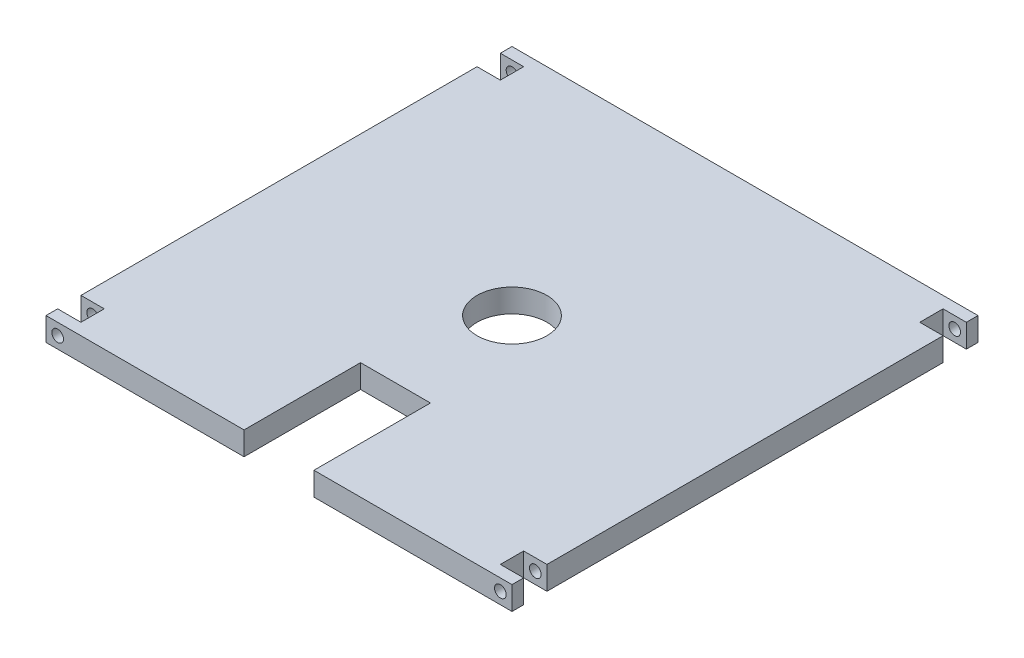
ISO-10303-21;
HEADER;
FILE_DESCRIPTION(('STEP AP214'),'2;1');
FILE_NAME('part.step','',(''),(''),'','','');
FILE_SCHEMA(('AUTOMOTIVE_DESIGN { 1 0 10303 214 1 1 1 1 }'));
ENDSEC;
DATA;
#1=APPLICATION_CONTEXT('core data for automotive mechanical design processes');
#2=APPLICATION_PROTOCOL_DEFINITION('international standard','automotive_design',2000,#1);
#3=PRODUCT_CONTEXT('',#1,'mechanical');
#4=PRODUCT('Part','Part','',(#3));
#5=PRODUCT_RELATED_PRODUCT_CATEGORY('part','',(#4));
#6=PRODUCT_DEFINITION_FORMATION('','',#4);
#7=PRODUCT_DEFINITION_CONTEXT('part definition',#1,'design');
#8=PRODUCT_DEFINITION('design','',#6,#7);
#9=PRODUCT_DEFINITION_SHAPE('','',#8);
#10=(LENGTH_UNIT() NAMED_UNIT(*) SI_UNIT(.MILLI.,.METRE.));
#11=(NAMED_UNIT(*) PLANE_ANGLE_UNIT() SI_UNIT($,.RADIAN.));
#12=(NAMED_UNIT(*) SI_UNIT($,.STERADIAN.) SOLID_ANGLE_UNIT());
#13=UNCERTAINTY_MEASURE_WITH_UNIT(LENGTH_MEASURE(1.E-05),#10,'distance_accuracy_value','');
#14=(GEOMETRIC_REPRESENTATION_CONTEXT(3) GLOBAL_UNCERTAINTY_ASSIGNED_CONTEXT((#13)) GLOBAL_UNIT_ASSIGNED_CONTEXT((#10,
#11,#12)) REPRESENTATION_CONTEXT('',''));
#15=CARTESIAN_POINT('',(0.,0.,0.));
#16=DIRECTION('',(0.,0.,1.));
#17=DIRECTION('',(1.,0.,0.));
#18=AXIS2_PLACEMENT_3D('',#15,#16,#17);
#19=CARTESIAN_POINT('',(0.,10.,0.));
#20=DIRECTION('',(0.,1.,0.));
#21=DIRECTION('',(0.,0.,1.));
#22=AXIS2_PLACEMENT_3D('',#19,#20,#21);
#23=PLANE('',#22);
#24=DIRECTION('',(1.,0.,0.));
#25=VECTOR('',#24,1.);
#26=CARTESIAN_POINT('',(-15.,10.,100.));
#27=LINE('',#26,#25);
#28=CARTESIAN_POINT('',(-100.,10.,100.));
#29=VERTEX_POINT('',#28);
#30=CARTESIAN_POINT('',(-15.,10.,100.));
#31=VERTEX_POINT('',#30);
#32=EDGE_CURVE('E274',#29,#31,#27,.T.);
#33=ORIENTED_EDGE('',*,*,#32,.T.);
#34=DIRECTION('',(0.,0.,-1.));
#35=VECTOR('',#34,1.);
#36=CARTESIAN_POINT('',(-15.,10.,100.));
#37=LINE('',#36,#35);
#38=CARTESIAN_POINT('',(-15.,10.,50.));
#39=VERTEX_POINT('',#38);
#40=EDGE_CURVE('E142',#31,#39,#37,.T.);
#41=ORIENTED_EDGE('',*,*,#40,.T.);
#42=DIRECTION('',(1.,0.,0.));
#43=VECTOR('',#42,1.);
#44=CARTESIAN_POINT('',(-15.,10.,50.));
#45=LINE('',#44,#43);
#46=CARTESIAN_POINT('',(15.,10.,50.));
#47=VERTEX_POINT('',#46);
#48=EDGE_CURVE('E338',#39,#47,#45,.T.);
#49=ORIENTED_EDGE('',*,*,#48,.T.);
#50=DIRECTION('',(0.,0.,1.));
#51=VECTOR('',#50,1.);
#52=CARTESIAN_POINT('',(15.,10.,100.));
#53=LINE('',#52,#51);
#54=CARTESIAN_POINT('',(15.,10.,100.));
#55=VERTEX_POINT('',#54);
#56=EDGE_CURVE('E357',#47,#55,#53,.T.);
#57=ORIENTED_EDGE('',*,*,#56,.T.);
#58=DIRECTION('',(1.,0.,0.));
#59=VECTOR('',#58,1.);
#60=CARTESIAN_POINT('',(100.,10.,100.));
#61=LINE('',#60,#59);
#62=CARTESIAN_POINT('',(100.,10.,100.));
#63=VERTEX_POINT('',#62);
#64=EDGE_CURVE('E354',#55,#63,#61,.T.);
#65=ORIENTED_EDGE('',*,*,#64,.T.);
#66=DIRECTION('',(0.,0.,-1.));
#67=VECTOR('',#66,1.);
#68=CARTESIAN_POINT('',(100.,10.,95.));
#69=LINE('',#68,#67);
#70=CARTESIAN_POINT('',(100.,10.,95.));
#71=VERTEX_POINT('',#70);
#72=EDGE_CURVE('E356',#63,#71,#69,.T.);
#73=ORIENTED_EDGE('',*,*,#72,.T.);
#74=DIRECTION('',(-1.,0.,0.));
#75=VECTOR('',#74,1.);
#76=CARTESIAN_POINT('',(100.,10.,95.));
#77=LINE('',#76,#75);
#78=CARTESIAN_POINT('',(90.,10.,95.));
#79=VERTEX_POINT('',#78);
#80=EDGE_CURVE('E359',#71,#79,#77,.T.);
#81=ORIENTED_EDGE('',*,*,#80,.T.);
#82=DIRECTION('',(0.,0.,-1.));
#83=VECTOR('',#82,1.);
#84=CARTESIAN_POINT('',(90.,10.,95.));
#85=LINE('',#84,#83);
#86=CARTESIAN_POINT('',(90.,10.,85.));
#87=VERTEX_POINT('',#86);
#88=EDGE_CURVE('E365',#79,#87,#85,.T.);
#89=ORIENTED_EDGE('',*,*,#88,.T.);
#90=DIRECTION('',(1.,0.,0.));
#91=VECTOR('',#90,1.);
#92=CARTESIAN_POINT('',(90.,10.,85.));
#93=LINE('',#92,#91);
#94=CARTESIAN_POINT('',(100.,10.,85.));
#95=VERTEX_POINT('',#94);
#96=EDGE_CURVE('E367',#87,#95,#93,.T.);
#97=ORIENTED_EDGE('',*,*,#96,.T.);
#98=DIRECTION('',(0.,0.,-1.));
#99=VECTOR('',#98,1.);
#100=CARTESIAN_POINT('',(100.,10.,-85.));
#101=LINE('',#100,#99);
#102=CARTESIAN_POINT('',(100.,10.,-85.));
#103=VERTEX_POINT('',#102);
#104=EDGE_CURVE('E369',#95,#103,#101,.T.);
#105=ORIENTED_EDGE('',*,*,#104,.T.);
#106=DIRECTION('',(-1.,0.,0.));
#107=VECTOR('',#106,1.);
#108=CARTESIAN_POINT('',(90.,10.,-85.));
#109=LINE('',#108,#107);
#110=CARTESIAN_POINT('',(90.,10.,-85.));
#111=VERTEX_POINT('',#110);
#112=EDGE_CURVE('E371',#103,#111,#109,.T.);
#113=ORIENTED_EDGE('',*,*,#112,.T.);
#114=DIRECTION('',(0.,0.,-1.));
#115=VECTOR('',#114,1.);
#116=CARTESIAN_POINT('',(90.,10.,-95.));
#117=LINE('',#116,#115);
#118=CARTESIAN_POINT('',(90.,10.,-95.));
#119=VERTEX_POINT('',#118);
#120=EDGE_CURVE('E373',#111,#119,#117,.T.);
#121=ORIENTED_EDGE('',*,*,#120,.T.);
#122=DIRECTION('',(1.,0.,0.));
#123=VECTOR('',#122,1.);
#124=CARTESIAN_POINT('',(100.,10.,-95.));
#125=LINE('',#124,#123);
#126=CARTESIAN_POINT('',(100.,10.,-95.));
#127=VERTEX_POINT('',#126);
#128=EDGE_CURVE('E375',#119,#127,#125,.T.);
#129=ORIENTED_EDGE('',*,*,#128,.T.);
#130=DIRECTION('',(0.,0.,-1.));
#131=VECTOR('',#130,1.);
#132=CARTESIAN_POINT('',(100.,10.,-100.));
#133=LINE('',#132,#131);
#134=CARTESIAN_POINT('',(100.,10.,-100.));
#135=VERTEX_POINT('',#134);
#136=EDGE_CURVE('E377',#127,#135,#133,.T.);
#137=ORIENTED_EDGE('',*,*,#136,.T.);
#138=DIRECTION('',(-1.,0.,0.));
#139=VECTOR('',#138,1.);
#140=CARTESIAN_POINT('',(100.,10.,-100.));
#141=LINE('',#140,#139);
#142=CARTESIAN_POINT('',(-100.,10.,-100.));
#143=VERTEX_POINT('',#142);
#144=EDGE_CURVE('E379',#135,#143,#141,.T.);
#145=ORIENTED_EDGE('',*,*,#144,.T.);
#146=DIRECTION('',(0.,0.,1.));
#147=VECTOR('',#146,1.);
#148=CARTESIAN_POINT('',(-100.,10.,-100.));
#149=LINE('',#148,#147);
#150=CARTESIAN_POINT('',(-100.,10.,-95.));
#151=VERTEX_POINT('',#150);
#152=EDGE_CURVE('E381',#143,#151,#149,.T.);
#153=ORIENTED_EDGE('',*,*,#152,.T.);
#154=DIRECTION('',(1.,0.,0.));
#155=VECTOR('',#154,1.);
#156=CARTESIAN_POINT('',(-100.,10.,-95.));
#157=LINE('',#156,#155);
#158=CARTESIAN_POINT('',(-90.,10.,-95.));
#159=VERTEX_POINT('',#158);
#160=EDGE_CURVE('E383',#151,#159,#157,.T.);
#161=ORIENTED_EDGE('',*,*,#160,.T.);
#162=DIRECTION('',(0.,0.,1.));
#163=VECTOR('',#162,1.);
#164=CARTESIAN_POINT('',(-90.,10.,-95.));
#165=LINE('',#164,#163);
#166=CARTESIAN_POINT('',(-90.,10.,-85.));
#167=VERTEX_POINT('',#166);
#168=EDGE_CURVE('E385',#159,#167,#165,.T.);
#169=ORIENTED_EDGE('',*,*,#168,.T.);
#170=DIRECTION('',(-1.,0.,0.));
#171=VECTOR('',#170,1.);
#172=CARTESIAN_POINT('',(-90.,10.,-85.));
#173=LINE('',#172,#171);
#174=CARTESIAN_POINT('',(-100.,10.,-85.));
#175=VERTEX_POINT('',#174);
#176=EDGE_CURVE('E387',#167,#175,#173,.T.);
#177=ORIENTED_EDGE('',*,*,#176,.T.);
#178=DIRECTION('',(0.,0.,1.));
#179=VECTOR('',#178,1.);
#180=CARTESIAN_POINT('',(-100.,10.,-85.));
#181=LINE('',#180,#179);
#182=CARTESIAN_POINT('',(-100.,10.,85.));
#183=VERTEX_POINT('',#182);
#184=EDGE_CURVE('E389',#175,#183,#181,.T.);
#185=ORIENTED_EDGE('',*,*,#184,.T.);
#186=DIRECTION('',(1.,0.,0.));
#187=VECTOR('',#186,1.);
#188=CARTESIAN_POINT('',(-90.,10.,85.));
#189=LINE('',#188,#187);
#190=CARTESIAN_POINT('',(-90.,10.,85.));
#191=VERTEX_POINT('',#190);
#192=EDGE_CURVE('E209',#183,#191,#189,.T.);
#193=ORIENTED_EDGE('',*,*,#192,.T.);
#194=DIRECTION('',(0.,0.,1.));
#195=VECTOR('',#194,1.);
#196=CARTESIAN_POINT('',(-90.,10.,95.));
#197=LINE('',#196,#195);
#198=CARTESIAN_POINT('',(-90.,10.,95.));
#199=VERTEX_POINT('',#198);
#200=EDGE_CURVE('E203',#191,#199,#197,.T.);
#201=ORIENTED_EDGE('',*,*,#200,.T.);
#202=DIRECTION('',(-1.,0.,0.));
#203=VECTOR('',#202,1.);
#204=CARTESIAN_POINT('',(-100.,10.,95.));
#205=LINE('',#204,#203);
#206=CARTESIAN_POINT('',(-100.,10.,95.));
#207=VERTEX_POINT('',#206);
#208=EDGE_CURVE('E207',#199,#207,#205,.T.);
#209=ORIENTED_EDGE('',*,*,#208,.T.);
#210=DIRECTION('',(0.,0.,1.));
#211=VECTOR('',#210,1.);
#212=CARTESIAN_POINT('',(-100.,10.,95.));
#213=LINE('',#212,#211);
#214=EDGE_CURVE('E51',#207,#29,#213,.T.);
#215=ORIENTED_EDGE('',*,*,#214,.T.);
#216=EDGE_LOOP('',(#33,#41,#49,#57,#65,#73,#81,#89,#97,#105,#113,#121,#129,#137,#145,#153,#161,
#169,#177,#185,#193,#201,#209,#215));
#217=FACE_BOUND('',#216,.T.);
#218=CARTESIAN_POINT('',(0.,10.,0.));
#219=DIRECTION('',(0.,1.,0.));
#220=DIRECTION('',(0.,0.,1.));
#221=AXIS2_PLACEMENT_3D('',#218,#219,#220);
#222=CIRCLE('',#221,15.);
#223=CARTESIAN_POINT('',(0.,10.,15.));
#224=VERTEX_POINT('',#223);
#225=EDGE_CURVE('E231',#224,#224,#222,.T.);
#226=ORIENTED_EDGE('',*,*,#225,.F.);
#227=EDGE_LOOP('',(#226));
#228=FACE_BOUND('',#227,.T.);
#229=ADVANCED_FACE('F33',(#217,#228),#23,.T.);
#230=CARTESIAN_POINT('',(0.,0.,0.));
#231=DIRECTION('',(0.,1.,0.));
#232=DIRECTION('',(0.,0.,1.));
#233=AXIS2_PLACEMENT_3D('',#230,#231,#232);
#234=PLANE('',#233);
#235=DIRECTION('',(1.,0.,0.));
#236=VECTOR('',#235,1.);
#237=CARTESIAN_POINT('',(-15.,0.,100.));
#238=LINE('',#237,#236);
#239=CARTESIAN_POINT('',(-100.,0.,100.));
#240=VERTEX_POINT('',#239);
#241=CARTESIAN_POINT('',(-15.,0.,100.));
#242=VERTEX_POINT('',#241);
#243=EDGE_CURVE('E227',#240,#242,#238,.T.);
#244=ORIENTED_EDGE('',*,*,#243,.F.);
#245=DIRECTION('',(0.,0.,1.));
#246=VECTOR('',#245,1.);
#247=CARTESIAN_POINT('',(-100.,0.,95.));
#248=LINE('',#247,#246);
#249=CARTESIAN_POINT('',(-100.,0.,95.));
#250=VERTEX_POINT('',#249);
#251=EDGE_CURVE('E134',#250,#240,#248,.T.);
#252=ORIENTED_EDGE('',*,*,#251,.F.);
#253=DIRECTION('',(-1.,0.,0.));
#254=VECTOR('',#253,1.);
#255=CARTESIAN_POINT('',(-100.,0.,95.));
#256=LINE('',#255,#254);
#257=CARTESIAN_POINT('',(-90.,0.,95.));
#258=VERTEX_POINT('',#257);
#259=EDGE_CURVE('E128',#258,#250,#256,.T.);
#260=ORIENTED_EDGE('',*,*,#259,.F.);
#261=DIRECTION('',(0.,0.,1.));
#262=VECTOR('',#261,1.);
#263=CARTESIAN_POINT('',(-90.,0.,95.));
#264=LINE('',#263,#262);
#265=CARTESIAN_POINT('',(-90.,0.,85.));
#266=VERTEX_POINT('',#265);
#267=EDGE_CURVE('E217',#266,#258,#264,.T.);
#268=ORIENTED_EDGE('',*,*,#267,.F.);
#269=DIRECTION('',(1.,0.,0.));
#270=VECTOR('',#269,1.);
#271=CARTESIAN_POINT('',(-90.,0.,85.));
#272=LINE('',#271,#270);
#273=CARTESIAN_POINT('',(-100.,0.,85.));
#274=VERTEX_POINT('',#273);
#275=EDGE_CURVE('E269',#274,#266,#272,.T.);
#276=ORIENTED_EDGE('',*,*,#275,.F.);
#277=DIRECTION('',(0.,0.,1.));
#278=VECTOR('',#277,1.);
#279=CARTESIAN_POINT('',(-100.,0.,-85.));
#280=LINE('',#279,#278);
#281=CARTESIAN_POINT('',(-100.,0.,-85.));
#282=VERTEX_POINT('',#281);
#283=EDGE_CURVE('E267',#282,#274,#280,.T.);
#284=ORIENTED_EDGE('',*,*,#283,.F.);
#285=DIRECTION('',(-1.,0.,0.));
#286=VECTOR('',#285,1.);
#287=CARTESIAN_POINT('',(-90.,0.,-85.));
#288=LINE('',#287,#286);
#289=CARTESIAN_POINT('',(-90.,0.,-85.));
#290=VERTEX_POINT('',#289);
#291=EDGE_CURVE('E265',#290,#282,#288,.T.);
#292=ORIENTED_EDGE('',*,*,#291,.F.);
#293=DIRECTION('',(0.,0.,1.));
#294=VECTOR('',#293,1.);
#295=CARTESIAN_POINT('',(-90.,0.,-95.));
#296=LINE('',#295,#294);
#297=CARTESIAN_POINT('',(-90.,0.,-95.));
#298=VERTEX_POINT('',#297);
#299=EDGE_CURVE('E263',#298,#290,#296,.T.);
#300=ORIENTED_EDGE('',*,*,#299,.F.);
#301=DIRECTION('',(1.,0.,0.));
#302=VECTOR('',#301,1.);
#303=CARTESIAN_POINT('',(-100.,0.,-95.));
#304=LINE('',#303,#302);
#305=CARTESIAN_POINT('',(-100.,0.,-95.));
#306=VERTEX_POINT('',#305);
#307=EDGE_CURVE('E261',#306,#298,#304,.T.);
#308=ORIENTED_EDGE('',*,*,#307,.F.);
#309=DIRECTION('',(0.,0.,1.));
#310=VECTOR('',#309,1.);
#311=CARTESIAN_POINT('',(-100.,0.,-100.));
#312=LINE('',#311,#310);
#313=CARTESIAN_POINT('',(-100.,0.,-100.));
#314=VERTEX_POINT('',#313);
#315=EDGE_CURVE('E259',#314,#306,#312,.T.);
#316=ORIENTED_EDGE('',*,*,#315,.F.);
#317=DIRECTION('',(-1.,0.,0.));
#318=VECTOR('',#317,1.);
#319=CARTESIAN_POINT('',(100.,0.,-100.));
#320=LINE('',#319,#318);
#321=CARTESIAN_POINT('',(100.,0.,-100.));
#322=VERTEX_POINT('',#321);
#323=EDGE_CURVE('E257',#322,#314,#320,.T.);
#324=ORIENTED_EDGE('',*,*,#323,.F.);
#325=DIRECTION('',(0.,0.,-1.));
#326=VECTOR('',#325,1.);
#327=CARTESIAN_POINT('',(100.,0.,-100.));
#328=LINE('',#327,#326);
#329=CARTESIAN_POINT('',(100.,0.,-95.));
#330=VERTEX_POINT('',#329);
#331=EDGE_CURVE('E255',#330,#322,#328,.T.);
#332=ORIENTED_EDGE('',*,*,#331,.F.);
#333=DIRECTION('',(1.,0.,0.));
#334=VECTOR('',#333,1.);
#335=CARTESIAN_POINT('',(100.,0.,-95.));
#336=LINE('',#335,#334);
#337=CARTESIAN_POINT('',(90.,0.,-95.));
#338=VERTEX_POINT('',#337);
#339=EDGE_CURVE('E253',#338,#330,#336,.T.);
#340=ORIENTED_EDGE('',*,*,#339,.F.);
#341=DIRECTION('',(0.,0.,-1.));
#342=VECTOR('',#341,1.);
#343=CARTESIAN_POINT('',(90.,0.,-95.));
#344=LINE('',#343,#342);
#345=CARTESIAN_POINT('',(90.,0.,-85.));
#346=VERTEX_POINT('',#345);
#347=EDGE_CURVE('E251',#346,#338,#344,.T.);
#348=ORIENTED_EDGE('',*,*,#347,.F.);
#349=DIRECTION('',(-1.,0.,0.));
#350=VECTOR('',#349,1.);
#351=CARTESIAN_POINT('',(90.,0.,-85.));
#352=LINE('',#351,#350);
#353=CARTESIAN_POINT('',(100.,0.,-85.));
#354=VERTEX_POINT('',#353);
#355=EDGE_CURVE('E249',#354,#346,#352,.T.);
#356=ORIENTED_EDGE('',*,*,#355,.F.);
#357=DIRECTION('',(0.,0.,-1.));
#358=VECTOR('',#357,1.);
#359=CARTESIAN_POINT('',(100.,0.,-85.));
#360=LINE('',#359,#358);
#361=CARTESIAN_POINT('',(100.,0.,85.));
#362=VERTEX_POINT('',#361);
#363=EDGE_CURVE('E247',#362,#354,#360,.T.);
#364=ORIENTED_EDGE('',*,*,#363,.F.);
#365=DIRECTION('',(1.,0.,0.));
#366=VECTOR('',#365,1.);
#367=CARTESIAN_POINT('',(90.,0.,85.));
#368=LINE('',#367,#366);
#369=CARTESIAN_POINT('',(90.,0.,85.));
#370=VERTEX_POINT('',#369);
#371=EDGE_CURVE('E245',#370,#362,#368,.T.);
#372=ORIENTED_EDGE('',*,*,#371,.F.);
#373=DIRECTION('',(0.,0.,-1.));
#374=VECTOR('',#373,1.);
#375=CARTESIAN_POINT('',(90.,0.,95.));
#376=LINE('',#375,#374);
#377=CARTESIAN_POINT('',(90.,0.,95.));
#378=VERTEX_POINT('',#377);
#379=EDGE_CURVE('E243',#378,#370,#376,.T.);
#380=ORIENTED_EDGE('',*,*,#379,.F.);
#381=DIRECTION('',(-1.,0.,0.));
#382=VECTOR('',#381,1.);
#383=CARTESIAN_POINT('',(100.,0.,95.));
#384=LINE('',#383,#382);
#385=CARTESIAN_POINT('',(100.,0.,95.));
#386=VERTEX_POINT('',#385);
#387=EDGE_CURVE('E241',#386,#378,#384,.T.);
#388=ORIENTED_EDGE('',*,*,#387,.F.);
#389=DIRECTION('',(0.,0.,-1.));
#390=VECTOR('',#389,1.);
#391=CARTESIAN_POINT('',(100.,0.,95.));
#392=LINE('',#391,#390);
#393=CARTESIAN_POINT('',(100.,0.,100.));
#394=VERTEX_POINT('',#393);
#395=EDGE_CURVE('E239',#394,#386,#392,.T.);
#396=ORIENTED_EDGE('',*,*,#395,.F.);
#397=DIRECTION('',(1.,0.,0.));
#398=VECTOR('',#397,1.);
#399=CARTESIAN_POINT('',(100.,0.,100.));
#400=LINE('',#399,#398);
#401=CARTESIAN_POINT('',(15.,0.,100.));
#402=VERTEX_POINT('',#401);
#403=EDGE_CURVE('E237',#402,#394,#400,.T.);
#404=ORIENTED_EDGE('',*,*,#403,.F.);
#405=DIRECTION('',(0.,0.,1.));
#406=VECTOR('',#405,1.);
#407=CARTESIAN_POINT('',(15.,0.,100.));
#408=LINE('',#407,#406);
#409=CARTESIAN_POINT('',(15.,0.,50.));
#410=VERTEX_POINT('',#409);
#411=EDGE_CURVE('E235',#410,#402,#408,.T.);
#412=ORIENTED_EDGE('',*,*,#411,.F.);
#413=DIRECTION('',(1.,0.,0.));
#414=VECTOR('',#413,1.);
#415=CARTESIAN_POINT('',(-15.,0.,50.));
#416=LINE('',#415,#414);
#417=CARTESIAN_POINT('',(-15.,0.,50.));
#418=VERTEX_POINT('',#417);
#419=EDGE_CURVE('E233',#418,#410,#416,.T.);
#420=ORIENTED_EDGE('',*,*,#419,.F.);
#421=DIRECTION('',(0.,0.,-1.));
#422=VECTOR('',#421,1.);
#423=CARTESIAN_POINT('',(-15.,0.,100.));
#424=LINE('',#423,#422);
#425=EDGE_CURVE('E230',#242,#418,#424,.T.);
#426=ORIENTED_EDGE('',*,*,#425,.F.);
#427=EDGE_LOOP('',(#244,#252,#260,#268,#276,#284,#292,#300,#308,#316,#324,#332,#340,#348,#356,
#364,#372,#380,#388,#396,#404,#412,#420,#426));
#428=FACE_BOUND('',#427,.T.);
#429=CARTESIAN_POINT('',(0.,0.,0.));
#430=DIRECTION('',(0.,1.,0.));
#431=DIRECTION('',(0.,0.,1.));
#432=AXIS2_PLACEMENT_3D('',#429,#430,#431);
#433=CIRCLE('',#432,15.);
#434=CARTESIAN_POINT('',(0.,0.,15.));
#435=VERTEX_POINT('',#434);
#436=EDGE_CURVE('E480',#435,#435,#433,.T.);
#437=ORIENTED_EDGE('',*,*,#436,.T.);
#438=EDGE_LOOP('',(#437));
#439=FACE_BOUND('',#438,.T.);
#440=ADVANCED_FACE('F342',(#428,#439),#234,.F.);
#441=CARTESIAN_POINT('',(-15.,10.,100.));
#442=DIRECTION('',(0.,0.,-1.));
#443=DIRECTION('',(-1.,0.,0.));
#444=AXIS2_PLACEMENT_3D('',#441,#442,#443);
#445=PLANE('',#444);
#446=CARTESIAN_POINT('',(-95.,5.,100.));
#447=DIRECTION('',(0.,0.,1.));
#448=DIRECTION('',(1.,0.,0.));
#449=AXIS2_PLACEMENT_3D('',#446,#447,#448);
#450=CIRCLE('',#449,2.5);
#451=CARTESIAN_POINT('',(-92.5,5.,100.));
#452=VERTEX_POINT('',#451);
#453=EDGE_CURVE('E465',#452,#452,#450,.T.);
#454=ORIENTED_EDGE('',*,*,#453,.F.);
#455=EDGE_LOOP('',(#454));
#456=FACE_BOUND('',#455,.T.);
#457=ORIENTED_EDGE('',*,*,#243,.T.);
#458=DIRECTION('',(0.,-1.,0.));
#459=VECTOR('',#458,1.);
#460=CARTESIAN_POINT('',(-15.,10.,100.));
#461=LINE('',#460,#459);
#462=EDGE_CURVE('E11',#31,#242,#461,.T.);
#463=ORIENTED_EDGE('',*,*,#462,.F.);
#464=ORIENTED_EDGE('',*,*,#32,.F.);
#465=DIRECTION('',(0.,-1.,0.));
#466=VECTOR('',#465,1.);
#467=CARTESIAN_POINT('',(-100.,10.,100.));
#468=LINE('',#467,#466);
#469=EDGE_CURVE('E223',#29,#240,#468,.T.);
#470=ORIENTED_EDGE('',*,*,#469,.T.);
#471=EDGE_LOOP('',(#457,#463,#464,#470));
#472=FACE_BOUND('',#471,.T.);
#473=ADVANCED_FACE('F35',(#456,#472),#445,.F.);
#474=CARTESIAN_POINT('',(-15.,10.,100.));
#475=DIRECTION('',(-1.,0.,0.));
#476=DIRECTION('',(0.,0.,1.));
#477=AXIS2_PLACEMENT_3D('',#474,#475,#476);
#478=PLANE('',#477);
#479=ORIENTED_EDGE('',*,*,#425,.T.);
#480=DIRECTION('',(0.,-1.,0.));
#481=VECTOR('',#480,1.);
#482=CARTESIAN_POINT('',(-15.,10.,50.));
#483=LINE('',#482,#481);
#484=EDGE_CURVE('E43',#39,#418,#483,.T.);
#485=ORIENTED_EDGE('',*,*,#484,.F.);
#486=ORIENTED_EDGE('',*,*,#40,.F.);
#487=ORIENTED_EDGE('',*,*,#462,.T.);
#488=EDGE_LOOP('',(#479,#485,#486,#487));
#489=FACE_BOUND('',#488,.T.);
#490=ADVANCED_FACE('F569',(#489),#478,.F.);
#491=CARTESIAN_POINT('',(-15.,10.,50.));
#492=DIRECTION('',(0.,0.,-1.));
#493=DIRECTION('',(-1.,0.,0.));
#494=AXIS2_PLACEMENT_3D('',#491,#492,#493);
#495=PLANE('',#494);
#496=ORIENTED_EDGE('',*,*,#419,.T.);
#497=DIRECTION('',(0.,-1.,0.));
#498=VECTOR('',#497,1.);
#499=CARTESIAN_POINT('',(15.,10.,50.));
#500=LINE('',#499,#498);
#501=EDGE_CURVE('E329',#47,#410,#500,.T.);
#502=ORIENTED_EDGE('',*,*,#501,.F.);
#503=ORIENTED_EDGE('',*,*,#48,.F.);
#504=ORIENTED_EDGE('',*,*,#484,.T.);
#505=EDGE_LOOP('',(#496,#502,#503,#504));
#506=FACE_BOUND('',#505,.T.);
#507=ADVANCED_FACE('F336',(#506),#495,.F.);
#508=CARTESIAN_POINT('',(15.,10.,100.));
#509=DIRECTION('',(1.,0.,0.));
#510=DIRECTION('',(0.,0.,-1.));
#511=AXIS2_PLACEMENT_3D('',#508,#509,#510);
#512=PLANE('',#511);
#513=ORIENTED_EDGE('',*,*,#411,.T.);
#514=DIRECTION('',(0.,-1.,0.));
#515=VECTOR('',#514,1.);
#516=CARTESIAN_POINT('',(15.,10.,100.));
#517=LINE('',#516,#515);
#518=EDGE_CURVE('E326',#55,#402,#517,.T.);
#519=ORIENTED_EDGE('',*,*,#518,.F.);
#520=ORIENTED_EDGE('',*,*,#56,.F.);
#521=ORIENTED_EDGE('',*,*,#501,.T.);
#522=EDGE_LOOP('',(#513,#519,#520,#521));
#523=FACE_BOUND('',#522,.T.);
#524=ADVANCED_FACE('F348',(#523),#512,.F.);
#525=CARTESIAN_POINT('',(100.,10.,100.));
#526=DIRECTION('',(0.,0.,-1.));
#527=DIRECTION('',(-1.,0.,0.));
#528=AXIS2_PLACEMENT_3D('',#525,#526,#527);
#529=PLANE('',#528);
#530=CARTESIAN_POINT('',(95.,5.,100.));
#531=DIRECTION('',(0.,0.,1.));
#532=DIRECTION('',(-1.,0.,0.));
#533=AXIS2_PLACEMENT_3D('',#530,#531,#532);
#534=CIRCLE('',#533,2.5);
#535=CARTESIAN_POINT('',(92.5,5.,100.));
#536=VERTEX_POINT('',#535);
#537=EDGE_CURVE('E456',#536,#536,#534,.T.);
#538=ORIENTED_EDGE('',*,*,#537,.F.);
#539=EDGE_LOOP('',(#538));
#540=FACE_BOUND('',#539,.T.);
#541=ORIENTED_EDGE('',*,*,#403,.T.);
#542=DIRECTION('',(0.,-1.,0.));
#543=VECTOR('',#542,1.);
#544=CARTESIAN_POINT('',(100.,10.,100.));
#545=LINE('',#544,#543);
#546=EDGE_CURVE('E323',#63,#394,#545,.T.);
#547=ORIENTED_EDGE('',*,*,#546,.F.);
#548=ORIENTED_EDGE('',*,*,#64,.F.);
#549=ORIENTED_EDGE('',*,*,#518,.T.);
#550=EDGE_LOOP('',(#541,#547,#548,#549));
#551=FACE_BOUND('',#550,.T.);
#552=ADVANCED_FACE('F352',(#540,#551),#529,.F.);
#553=CARTESIAN_POINT('',(100.,10.,95.));
#554=DIRECTION('',(-1.,0.,0.));
#555=DIRECTION('',(0.,0.,1.));
#556=AXIS2_PLACEMENT_3D('',#553,#554,#555);
#557=PLANE('',#556);
#558=ORIENTED_EDGE('',*,*,#395,.T.);
#559=DIRECTION('',(0.,-1.,0.));
#560=VECTOR('',#559,1.);
#561=CARTESIAN_POINT('',(100.,10.,95.));
#562=LINE('',#561,#560);
#563=EDGE_CURVE('E320',#71,#386,#562,.T.);
#564=ORIENTED_EDGE('',*,*,#563,.F.);
#565=ORIENTED_EDGE('',*,*,#72,.F.);
#566=ORIENTED_EDGE('',*,*,#546,.T.);
#567=EDGE_LOOP('',(#558,#564,#565,#566));
#568=FACE_BOUND('',#567,.T.);
#569=ADVANCED_FACE('F558',(#568),#557,.F.);
#570=CARTESIAN_POINT('',(100.,10.,95.));
#571=DIRECTION('',(0.,0.,1.));
#572=DIRECTION('',(1.,0.,0.));
#573=AXIS2_PLACEMENT_3D('',#570,#571,#572);
#574=PLANE('',#573);
#575=CARTESIAN_POINT('',(95.,5.,95.));
#576=DIRECTION('',(0.,0.,1.));
#577=DIRECTION('',(1.,0.,0.));
#578=AXIS2_PLACEMENT_3D('',#575,#576,#577);
#579=CIRCLE('',#578,2.5);
#580=CARTESIAN_POINT('',(97.5,5.,95.));
#581=VERTEX_POINT('',#580);
#582=EDGE_CURVE('E462',#581,#581,#579,.T.);
#583=ORIENTED_EDGE('',*,*,#582,.T.);
#584=EDGE_LOOP('',(#583));
#585=FACE_BOUND('',#584,.T.);
#586=ORIENTED_EDGE('',*,*,#387,.T.);
#587=DIRECTION('',(0.,-1.,0.));
#588=VECTOR('',#587,1.);
#589=CARTESIAN_POINT('',(90.,10.,95.));
#590=LINE('',#589,#588);
#591=EDGE_CURVE('E317',#79,#378,#590,.T.);
#592=ORIENTED_EDGE('',*,*,#591,.F.);
#593=ORIENTED_EDGE('',*,*,#80,.F.);
#594=ORIENTED_EDGE('',*,*,#563,.T.);
#595=EDGE_LOOP('',(#586,#592,#593,#594));
#596=FACE_BOUND('',#595,.T.);
#597=ADVANCED_FACE('F554',(#585,#596),#574,.F.);
#598=CARTESIAN_POINT('',(90.,10.,95.));
#599=DIRECTION('',(-1.,0.,0.));
#600=DIRECTION('',(0.,0.,1.));
#601=AXIS2_PLACEMENT_3D('',#598,#599,#600);
#602=PLANE('',#601);
#603=ORIENTED_EDGE('',*,*,#379,.T.);
#604=DIRECTION('',(0.,-1.,0.));
#605=VECTOR('',#604,1.);
#606=CARTESIAN_POINT('',(90.,10.,85.));
#607=LINE('',#606,#605);
#608=EDGE_CURVE('E314',#87,#370,#607,.T.);
#609=ORIENTED_EDGE('',*,*,#608,.F.);
#610=ORIENTED_EDGE('',*,*,#88,.F.);
#611=ORIENTED_EDGE('',*,*,#591,.T.);
#612=EDGE_LOOP('',(#603,#609,#610,#611));
#613=FACE_BOUND('',#612,.T.);
#614=ADVANCED_FACE('F550',(#613),#602,.F.);
#615=CARTESIAN_POINT('',(90.,10.,85.));
#616=DIRECTION('',(0.,0.,-1.));
#617=DIRECTION('',(-1.,0.,0.));
#618=AXIS2_PLACEMENT_3D('',#615,#616,#617);
#619=PLANE('',#618);
#620=CARTESIAN_POINT('',(95.,5.,85.));
#621=DIRECTION('',(0.,0.,-1.));
#622=DIRECTION('',(-1.,0.,0.));
#623=AXIS2_PLACEMENT_3D('',#620,#621,#622);
#624=CIRCLE('',#623,2.5);
#625=CARTESIAN_POINT('',(92.5,5.,85.));
#626=VERTEX_POINT('',#625);
#627=EDGE_CURVE('E454',#626,#626,#624,.T.);
#628=ORIENTED_EDGE('',*,*,#627,.T.);
#629=EDGE_LOOP('',(#628));
#630=FACE_BOUND('',#629,.T.);
#631=ORIENTED_EDGE('',*,*,#371,.T.);
#632=DIRECTION('',(0.,-1.,0.));
#633=VECTOR('',#632,1.);
#634=CARTESIAN_POINT('',(100.,10.,85.));
#635=LINE('',#634,#633);
#636=EDGE_CURVE('E311',#95,#362,#635,.T.);
#637=ORIENTED_EDGE('',*,*,#636,.F.);
#638=ORIENTED_EDGE('',*,*,#96,.F.);
#639=ORIENTED_EDGE('',*,*,#608,.T.);
#640=EDGE_LOOP('',(#631,#637,#638,#639));
#641=FACE_BOUND('',#640,.T.);
#642=ADVANCED_FACE('F546',(#630,#641),#619,.F.);
#643=CARTESIAN_POINT('',(100.,10.,-85.));
#644=DIRECTION('',(-1.,0.,0.));
#645=DIRECTION('',(0.,0.,1.));
#646=AXIS2_PLACEMENT_3D('',#643,#644,#645);
#647=PLANE('',#646);
#648=ORIENTED_EDGE('',*,*,#363,.T.);
#649=DIRECTION('',(0.,-1.,0.));
#650=VECTOR('',#649,1.);
#651=CARTESIAN_POINT('',(100.,10.,-85.));
#652=LINE('',#651,#650);
#653=EDGE_CURVE('E308',#103,#354,#652,.T.);
#654=ORIENTED_EDGE('',*,*,#653,.F.);
#655=ORIENTED_EDGE('',*,*,#104,.F.);
#656=ORIENTED_EDGE('',*,*,#636,.T.);
#657=EDGE_LOOP('',(#648,#654,#655,#656));
#658=FACE_BOUND('',#657,.T.);
#659=ADVANCED_FACE('F542',(#658),#647,.F.);
#660=CARTESIAN_POINT('',(90.,10.,-85.));
#661=DIRECTION('',(0.,0.,1.));
#662=DIRECTION('',(1.,0.,0.));
#663=AXIS2_PLACEMENT_3D('',#660,#661,#662);
#664=PLANE('',#663);
#665=CARTESIAN_POINT('',(95.,5.,-85.));
#666=DIRECTION('',(0.,0.,1.));
#667=DIRECTION('',(1.,0.,0.));
#668=AXIS2_PLACEMENT_3D('',#665,#666,#667);
#669=CIRCLE('',#668,2.5);
#670=CARTESIAN_POINT('',(97.5,5.,-85.));
#671=VERTEX_POINT('',#670);
#672=EDGE_CURVE('E451',#671,#671,#669,.T.);
#673=ORIENTED_EDGE('',*,*,#672,.T.);
#674=EDGE_LOOP('',(#673));
#675=FACE_BOUND('',#674,.T.);
#676=ORIENTED_EDGE('',*,*,#355,.T.);
#677=DIRECTION('',(0.,-1.,0.));
#678=VECTOR('',#677,1.);
#679=CARTESIAN_POINT('',(90.,10.,-85.));
#680=LINE('',#679,#678);
#681=EDGE_CURVE('E305',#111,#346,#680,.T.);
#682=ORIENTED_EDGE('',*,*,#681,.F.);
#683=ORIENTED_EDGE('',*,*,#112,.F.);
#684=ORIENTED_EDGE('',*,*,#653,.T.);
#685=EDGE_LOOP('',(#676,#682,#683,#684));
#686=FACE_BOUND('',#685,.T.);
#687=ADVANCED_FACE('F538',(#675,#686),#664,.F.);
#688=CARTESIAN_POINT('',(90.,10.,-95.));
#689=DIRECTION('',(-1.,0.,0.));
#690=DIRECTION('',(0.,0.,1.));
#691=AXIS2_PLACEMENT_3D('',#688,#689,#690);
#692=PLANE('',#691);
#693=ORIENTED_EDGE('',*,*,#347,.T.);
#694=DIRECTION('',(0.,-1.,0.));
#695=VECTOR('',#694,1.);
#696=CARTESIAN_POINT('',(90.,10.,-95.));
#697=LINE('',#696,#695);
#698=EDGE_CURVE('E302',#119,#338,#697,.T.);
#699=ORIENTED_EDGE('',*,*,#698,.F.);
#700=ORIENTED_EDGE('',*,*,#120,.F.);
#701=ORIENTED_EDGE('',*,*,#681,.T.);
#702=EDGE_LOOP('',(#693,#699,#700,#701));
#703=FACE_BOUND('',#702,.T.);
#704=ADVANCED_FACE('F535',(#703),#692,.F.);
#705=CARTESIAN_POINT('',(100.,10.,-95.));
#706=DIRECTION('',(0.,0.,-1.));
#707=DIRECTION('',(-1.,0.,0.));
#708=AXIS2_PLACEMENT_3D('',#705,#706,#707);
#709=PLANE('',#708);
#710=CARTESIAN_POINT('',(95.,5.,-95.));
#711=DIRECTION('',(0.,0.,-1.));
#712=DIRECTION('',(-1.,0.,0.));
#713=AXIS2_PLACEMENT_3D('',#710,#711,#712);
#714=CIRCLE('',#713,2.5);
#715=CARTESIAN_POINT('',(92.5,5.,-95.));
#716=VERTEX_POINT('',#715);
#717=EDGE_CURVE('E449',#716,#716,#714,.T.);
#718=ORIENTED_EDGE('',*,*,#717,.T.);
#719=EDGE_LOOP('',(#718));
#720=FACE_BOUND('',#719,.T.);
#721=ORIENTED_EDGE('',*,*,#339,.T.);
#722=DIRECTION('',(0.,-1.,0.));
#723=VECTOR('',#722,1.);
#724=CARTESIAN_POINT('',(100.,10.,-95.));
#725=LINE('',#724,#723);
#726=EDGE_CURVE('E299',#127,#330,#725,.T.);
#727=ORIENTED_EDGE('',*,*,#726,.F.);
#728=ORIENTED_EDGE('',*,*,#128,.F.);
#729=ORIENTED_EDGE('',*,*,#698,.T.);
#730=EDGE_LOOP('',(#721,#727,#728,#729));
#731=FACE_BOUND('',#730,.T.);
#732=ADVANCED_FACE('F531',(#720,#731),#709,.F.);
#733=CARTESIAN_POINT('',(100.,10.,-100.));
#734=DIRECTION('',(-1.,0.,0.));
#735=DIRECTION('',(0.,0.,1.));
#736=AXIS2_PLACEMENT_3D('',#733,#734,#735);
#737=PLANE('',#736);
#738=ORIENTED_EDGE('',*,*,#331,.T.);
#739=DIRECTION('',(0.,-1.,0.));
#740=VECTOR('',#739,1.);
#741=CARTESIAN_POINT('',(100.,10.,-100.));
#742=LINE('',#741,#740);
#743=EDGE_CURVE('E296',#135,#322,#742,.T.);
#744=ORIENTED_EDGE('',*,*,#743,.F.);
#745=ORIENTED_EDGE('',*,*,#136,.F.);
#746=ORIENTED_EDGE('',*,*,#726,.T.);
#747=EDGE_LOOP('',(#738,#744,#745,#746));
#748=FACE_BOUND('',#747,.T.);
#749=ADVANCED_FACE('F527',(#748),#737,.F.);
#750=CARTESIAN_POINT('',(100.,10.,-100.));
#751=DIRECTION('',(0.,0.,1.));
#752=DIRECTION('',(1.,0.,0.));
#753=AXIS2_PLACEMENT_3D('',#750,#751,#752);
#754=PLANE('',#753);
#755=CARTESIAN_POINT('',(95.,5.,-100.));
#756=DIRECTION('',(0.,0.,1.));
#757=DIRECTION('',(-1.,0.,0.));
#758=AXIS2_PLACEMENT_3D('',#755,#756,#757);
#759=CIRCLE('',#758,2.5);
#760=CARTESIAN_POINT('',(92.5,5.,-100.));
#761=VERTEX_POINT('',#760);
#762=EDGE_CURVE('E446',#761,#761,#759,.T.);
#763=ORIENTED_EDGE('',*,*,#762,.T.);
#764=EDGE_LOOP('',(#763));
#765=FACE_BOUND('',#764,.T.);
#766=CARTESIAN_POINT('',(-95.,5.,-100.));
#767=DIRECTION('',(0.,0.,1.));
#768=DIRECTION('',(1.,0.,0.));
#769=AXIS2_PLACEMENT_3D('',#766,#767,#768);
#770=CIRCLE('',#769,2.5);
#771=CARTESIAN_POINT('',(-92.5,5.,-100.));
#772=VERTEX_POINT('',#771);
#773=EDGE_CURVE('E466',#772,#772,#770,.T.);
#774=ORIENTED_EDGE('',*,*,#773,.T.);
#775=EDGE_LOOP('',(#774));
#776=FACE_BOUND('',#775,.T.);
#777=ORIENTED_EDGE('',*,*,#323,.T.);
#778=DIRECTION('',(0.,-1.,0.));
#779=VECTOR('',#778,1.);
#780=CARTESIAN_POINT('',(-100.,10.,-100.));
#781=LINE('',#780,#779);
#782=EDGE_CURVE('E293',#143,#314,#781,.T.);
#783=ORIENTED_EDGE('',*,*,#782,.F.);
#784=ORIENTED_EDGE('',*,*,#144,.F.);
#785=ORIENTED_EDGE('',*,*,#743,.T.);
#786=EDGE_LOOP('',(#777,#783,#784,#785));
#787=FACE_BOUND('',#786,.T.);
#788=ADVANCED_FACE('F523',(#765,#776,#787),#754,.F.);
#789=CARTESIAN_POINT('',(-100.,10.,-100.));
#790=DIRECTION('',(1.,0.,0.));
#791=DIRECTION('',(0.,0.,-1.));
#792=AXIS2_PLACEMENT_3D('',#789,#790,#791);
#793=PLANE('',#792);
#794=ORIENTED_EDGE('',*,*,#315,.T.);
#795=DIRECTION('',(0.,-1.,0.));
#796=VECTOR('',#795,1.);
#797=CARTESIAN_POINT('',(-100.,10.,-95.));
#798=LINE('',#797,#796);
#799=EDGE_CURVE('E290',#151,#306,#798,.T.);
#800=ORIENTED_EDGE('',*,*,#799,.F.);
#801=ORIENTED_EDGE('',*,*,#152,.F.);
#802=ORIENTED_EDGE('',*,*,#782,.T.);
#803=EDGE_LOOP('',(#794,#800,#801,#802));
#804=FACE_BOUND('',#803,.T.);
#805=ADVANCED_FACE('F496',(#804),#793,.F.);
#806=CARTESIAN_POINT('',(-100.,10.,-95.));
#807=DIRECTION('',(0.,0.,-1.));
#808=DIRECTION('',(-1.,0.,0.));
#809=AXIS2_PLACEMENT_3D('',#806,#807,#808);
#810=PLANE('',#809);
#811=CARTESIAN_POINT('',(-95.,5.,-95.));
#812=DIRECTION('',(0.,0.,-1.));
#813=DIRECTION('',(-1.,0.,0.));
#814=AXIS2_PLACEMENT_3D('',#811,#812,#813);
#815=CIRCLE('',#814,2.5);
#816=CARTESIAN_POINT('',(-97.5,5.,-95.));
#817=VERTEX_POINT('',#816);
#818=EDGE_CURVE('E477',#817,#817,#815,.T.);
#819=ORIENTED_EDGE('',*,*,#818,.T.);
#820=EDGE_LOOP('',(#819));
#821=FACE_BOUND('',#820,.T.);
#822=ORIENTED_EDGE('',*,*,#307,.T.);
#823=DIRECTION('',(0.,-1.,0.));
#824=VECTOR('',#823,1.);
#825=CARTESIAN_POINT('',(-90.,10.,-95.));
#826=LINE('',#825,#824);
#827=EDGE_CURVE('E287',#159,#298,#826,.T.);
#828=ORIENTED_EDGE('',*,*,#827,.F.);
#829=ORIENTED_EDGE('',*,*,#160,.F.);
#830=ORIENTED_EDGE('',*,*,#799,.T.);
#831=EDGE_LOOP('',(#822,#828,#829,#830));
#832=FACE_BOUND('',#831,.T.);
#833=ADVANCED_FACE('F491',(#821,#832),#810,.F.);
#834=CARTESIAN_POINT('',(-90.,10.,-95.));
#835=DIRECTION('',(1.,0.,0.));
#836=DIRECTION('',(0.,0.,-1.));
#837=AXIS2_PLACEMENT_3D('',#834,#835,#836);
#838=PLANE('',#837);
#839=ORIENTED_EDGE('',*,*,#299,.T.);
#840=DIRECTION('',(0.,-1.,0.));
#841=VECTOR('',#840,1.);
#842=CARTESIAN_POINT('',(-90.,10.,-85.));
#843=LINE('',#842,#841);
#844=EDGE_CURVE('E284',#167,#290,#843,.T.);
#845=ORIENTED_EDGE('',*,*,#844,.F.);
#846=ORIENTED_EDGE('',*,*,#168,.F.);
#847=ORIENTED_EDGE('',*,*,#827,.T.);
#848=EDGE_LOOP('',(#839,#845,#846,#847));
#849=FACE_BOUND('',#848,.T.);
#850=ADVANCED_FACE('F495',(#849),#838,.F.);
#851=CARTESIAN_POINT('',(-90.,10.,-85.));
#852=DIRECTION('',(0.,0.,1.));
#853=DIRECTION('',(1.,0.,0.));
#854=AXIS2_PLACEMENT_3D('',#851,#852,#853);
#855=PLANE('',#854);
#856=CARTESIAN_POINT('',(-95.,5.,-85.));
#857=DIRECTION('',(0.,0.,1.));
#858=DIRECTION('',(1.,0.,0.));
#859=AXIS2_PLACEMENT_3D('',#856,#857,#858);
#860=CIRCLE('',#859,2.5);
#861=CARTESIAN_POINT('',(-92.5,5.,-85.));
#862=VERTEX_POINT('',#861);
#863=EDGE_CURVE('E474',#862,#862,#860,.T.);
#864=ORIENTED_EDGE('',*,*,#863,.T.);
#865=EDGE_LOOP('',(#864));
#866=FACE_BOUND('',#865,.T.);
#867=ORIENTED_EDGE('',*,*,#291,.T.);
#868=DIRECTION('',(0.,-1.,0.));
#869=VECTOR('',#868,1.);
#870=CARTESIAN_POINT('',(-100.,10.,-85.));
#871=LINE('',#870,#869);
#872=EDGE_CURVE('E281',#175,#282,#871,.T.);
#873=ORIENTED_EDGE('',*,*,#872,.F.);
#874=ORIENTED_EDGE('',*,*,#176,.F.);
#875=ORIENTED_EDGE('',*,*,#844,.T.);
#876=EDGE_LOOP('',(#867,#873,#874,#875));
#877=FACE_BOUND('',#876,.T.);
#878=ADVANCED_FACE('F509',(#866,#877),#855,.F.);
#879=CARTESIAN_POINT('',(-100.,10.,-85.));
#880=DIRECTION('',(1.,0.,0.));
#881=DIRECTION('',(0.,0.,-1.));
#882=AXIS2_PLACEMENT_3D('',#879,#880,#881);
#883=PLANE('',#882);
#884=ORIENTED_EDGE('',*,*,#283,.T.);
#885=DIRECTION('',(0.,-1.,0.));
#886=VECTOR('',#885,1.);
#887=CARTESIAN_POINT('',(-100.,10.,85.));
#888=LINE('',#887,#886);
#889=EDGE_CURVE('E278',#183,#274,#888,.T.);
#890=ORIENTED_EDGE('',*,*,#889,.F.);
#891=ORIENTED_EDGE('',*,*,#184,.F.);
#892=ORIENTED_EDGE('',*,*,#872,.T.);
#893=EDGE_LOOP('',(#884,#890,#891,#892));
#894=FACE_BOUND('',#893,.T.);
#895=ADVANCED_FACE('F395',(#894),#883,.F.);
#896=CARTESIAN_POINT('',(-90.,10.,85.));
#897=DIRECTION('',(0.,0.,-1.));
#898=DIRECTION('',(-1.,0.,0.));
#899=AXIS2_PLACEMENT_3D('',#896,#897,#898);
#900=PLANE('',#899);
#901=CARTESIAN_POINT('',(-95.,5.,85.));
#902=DIRECTION('',(0.,0.,-1.));
#903=DIRECTION('',(-1.,0.,0.));
#904=AXIS2_PLACEMENT_3D('',#901,#902,#903);
#905=CIRCLE('',#904,2.5);
#906=CARTESIAN_POINT('',(-97.5,5.,85.));
#907=VERTEX_POINT('',#906);
#908=EDGE_CURVE('E471',#907,#907,#905,.T.);
#909=ORIENTED_EDGE('',*,*,#908,.T.);
#910=EDGE_LOOP('',(#909));
#911=FACE_BOUND('',#910,.T.);
#912=ORIENTED_EDGE('',*,*,#275,.T.);
#913=DIRECTION('',(0.,-1.,0.));
#914=VECTOR('',#913,1.);
#915=CARTESIAN_POINT('',(-90.,10.,85.));
#916=LINE('',#915,#914);
#917=EDGE_CURVE('E218',#191,#266,#916,.T.);
#918=ORIENTED_EDGE('',*,*,#917,.F.);
#919=ORIENTED_EDGE('',*,*,#192,.F.);
#920=ORIENTED_EDGE('',*,*,#889,.T.);
#921=EDGE_LOOP('',(#912,#918,#919,#920));
#922=FACE_BOUND('',#921,.T.);
#923=ADVANCED_FACE('F399',(#911,#922),#900,.F.);
#924=CARTESIAN_POINT('',(-90.,10.,95.));
#925=DIRECTION('',(1.,0.,0.));
#926=DIRECTION('',(0.,0.,-1.));
#927=AXIS2_PLACEMENT_3D('',#924,#925,#926);
#928=PLANE('',#927);
#929=ORIENTED_EDGE('',*,*,#267,.T.);
#930=DIRECTION('',(0.,-1.,0.));
#931=VECTOR('',#930,1.);
#932=CARTESIAN_POINT('',(-90.,10.,95.));
#933=LINE('',#932,#931);
#934=EDGE_CURVE('E214',#199,#258,#933,.T.);
#935=ORIENTED_EDGE('',*,*,#934,.F.);
#936=ORIENTED_EDGE('',*,*,#200,.F.);
#937=ORIENTED_EDGE('',*,*,#917,.T.);
#938=EDGE_LOOP('',(#929,#935,#936,#937));
#939=FACE_BOUND('',#938,.T.);
#940=ADVANCED_FACE('F215',(#939),#928,.F.);
#941=CARTESIAN_POINT('',(-100.,10.,95.));
#942=DIRECTION('',(0.,0.,1.));
#943=DIRECTION('',(1.,0.,0.));
#944=AXIS2_PLACEMENT_3D('',#941,#942,#943);
#945=PLANE('',#944);
#946=CARTESIAN_POINT('',(-95.,5.,95.));
#947=DIRECTION('',(0.,0.,1.));
#948=DIRECTION('',(1.,0.,0.));
#949=AXIS2_PLACEMENT_3D('',#946,#947,#948);
#950=CIRCLE('',#949,2.5);
#951=CARTESIAN_POINT('',(-92.5,5.,95.));
#952=VERTEX_POINT('',#951);
#953=EDGE_CURVE('E37',#952,#952,#950,.T.);
#954=ORIENTED_EDGE('',*,*,#953,.T.);
#955=EDGE_LOOP('',(#954));
#956=FACE_BOUND('',#955,.T.);
#957=ORIENTED_EDGE('',*,*,#259,.T.);
#958=DIRECTION('',(0.,-1.,0.));
#959=VECTOR('',#958,1.);
#960=CARTESIAN_POINT('',(-100.,10.,95.));
#961=LINE('',#960,#959);
#962=EDGE_CURVE('E219',#207,#250,#961,.T.);
#963=ORIENTED_EDGE('',*,*,#962,.F.);
#964=ORIENTED_EDGE('',*,*,#208,.F.);
#965=ORIENTED_EDGE('',*,*,#934,.T.);
#966=EDGE_LOOP('',(#957,#963,#964,#965));
#967=FACE_BOUND('',#966,.T.);
#968=ADVANCED_FACE('F221',(#956,#967),#945,.F.);
#969=CARTESIAN_POINT('',(-100.,10.,95.));
#970=DIRECTION('',(1.,0.,0.));
#971=DIRECTION('',(0.,0.,-1.));
#972=AXIS2_PLACEMENT_3D('',#969,#970,#971);
#973=PLANE('',#972);
#974=ORIENTED_EDGE('',*,*,#251,.T.);
#975=ORIENTED_EDGE('',*,*,#469,.F.);
#976=ORIENTED_EDGE('',*,*,#214,.F.);
#977=ORIENTED_EDGE('',*,*,#962,.T.);
#978=EDGE_LOOP('',(#974,#975,#976,#977));
#979=FACE_BOUND('',#978,.T.);
#980=ADVANCED_FACE('F403',(#979),#973,.F.);
#981=CARTESIAN_POINT('',(0.,10.,0.));
#982=DIRECTION('',(0.,-1.,0.));
#983=DIRECTION('',(0.,0.,-1.));
#984=AXIS2_PLACEMENT_3D('',#981,#982,#983);
#985=CYLINDRICAL_SURFACE('',#984,15.);
#986=ORIENTED_EDGE('',*,*,#225,.T.);
#987=EDGE_LOOP('',(#986));
#988=FACE_BOUND('',#987,.T.);
#989=ORIENTED_EDGE('',*,*,#436,.F.);
#990=EDGE_LOOP('',(#989));
#991=FACE_BOUND('',#990,.T.);
#992=ADVANCED_FACE('F405',(#988,#991),#985,.F.);
#993=CARTESIAN_POINT('',(-95.,5.,-100.));
#994=DIRECTION('',(0.,0.,1.));
#995=DIRECTION('',(1.,0.,0.));
#996=AXIS2_PLACEMENT_3D('',#993,#994,#995);
#997=CYLINDRICAL_SURFACE('',#996,2.5);
#998=ORIENTED_EDGE('',*,*,#453,.T.);
#999=EDGE_LOOP('',(#998));
#1000=FACE_BOUND('',#999,.T.);
#1001=ORIENTED_EDGE('',*,*,#953,.F.);
#1002=EDGE_LOOP('',(#1001));
#1003=FACE_BOUND('',#1002,.T.);
#1004=ADVANCED_FACE('F411',(#1000,#1003),#997,.F.);
#1005=ORIENTED_EDGE('',*,*,#908,.F.);
#1006=EDGE_LOOP('',(#1005));
#1007=FACE_BOUND('',#1006,.T.);
#1008=ORIENTED_EDGE('',*,*,#863,.F.);
#1009=EDGE_LOOP('',(#1008));
#1010=FACE_BOUND('',#1009,.T.);
#1011=ADVANCED_FACE('F427',(#1007,#1010),#997,.F.);
#1012=ORIENTED_EDGE('',*,*,#773,.F.);
#1013=EDGE_LOOP('',(#1012));
#1014=FACE_BOUND('',#1013,.T.);
#1015=ORIENTED_EDGE('',*,*,#818,.F.);
#1016=EDGE_LOOP('',(#1015));
#1017=FACE_BOUND('',#1016,.T.);
#1018=ADVANCED_FACE('F423',(#1014,#1017),#997,.F.);
#1019=CARTESIAN_POINT('',(95.,5.,-100.));
#1020=DIRECTION('',(0.,0.,1.));
#1021=DIRECTION('',(1.,0.,0.));
#1022=AXIS2_PLACEMENT_3D('',#1019,#1020,#1021);
#1023=CYLINDRICAL_SURFACE('',#1022,2.5);
#1024=ORIENTED_EDGE('',*,*,#762,.F.);
#1025=EDGE_LOOP('',(#1024));
#1026=FACE_BOUND('',#1025,.T.);
#1027=ORIENTED_EDGE('',*,*,#717,.F.);
#1028=EDGE_LOOP('',(#1027));
#1029=FACE_BOUND('',#1028,.T.);
#1030=ADVANCED_FACE('F426',(#1026,#1029),#1023,.F.);
#1031=ORIENTED_EDGE('',*,*,#672,.F.);
#1032=EDGE_LOOP('',(#1031));
#1033=FACE_BOUND('',#1032,.T.);
#1034=ORIENTED_EDGE('',*,*,#627,.F.);
#1035=EDGE_LOOP('',(#1034));
#1036=FACE_BOUND('',#1035,.T.);
#1037=ADVANCED_FACE('F431',(#1033,#1036),#1023,.F.);
#1038=ORIENTED_EDGE('',*,*,#537,.T.);
#1039=EDGE_LOOP('',(#1038));
#1040=FACE_BOUND('',#1039,.T.);
#1041=ORIENTED_EDGE('',*,*,#582,.F.);
#1042=EDGE_LOOP('',(#1041));
#1043=FACE_BOUND('',#1042,.T.);
#1044=ADVANCED_FACE('F429',(#1040,#1043),#1023,.F.);
#1045=CLOSED_SHELL('',(#229,#440,#473,#490,#507,#524,#552,#569,#597,#614,#642,#659,#687,#704,
#732,#749,#788,#805,#833,#850,#878,#895,#923,#940,#968,#980,#992,#1004,#1011,#1018,#1030,#1037,#1044));
#1046=MANIFOLD_SOLID_BREP('B2',#1045);
#1047=ADVANCED_BREP_SHAPE_REPRESENTATION('',(#18,#1046),#14);
#1048=SHAPE_DEFINITION_REPRESENTATION(#9,#1047);
ENDSEC;
END-ISO-10303-21;
